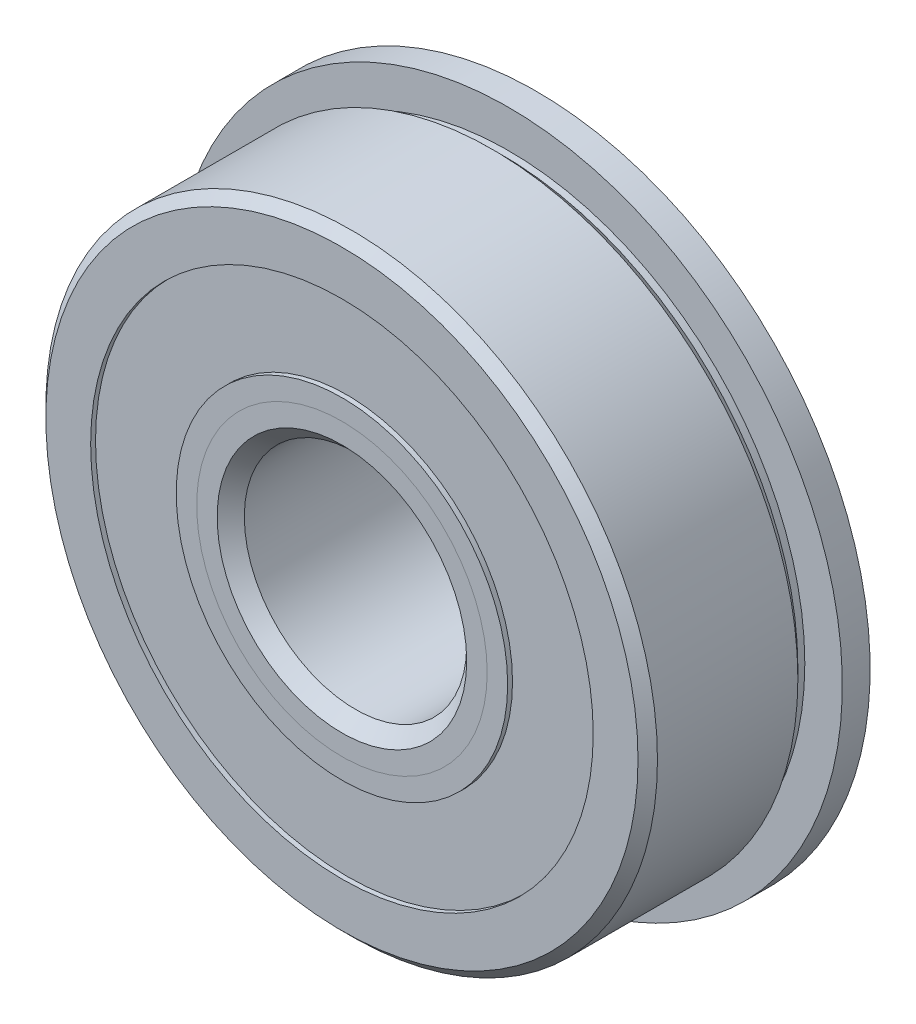
ISO-10303-21;
HEADER;
FILE_DESCRIPTION(('STEP AP214'),'2;1');
FILE_NAME('part.step','',(''),(''),'','','');
FILE_SCHEMA(('AUTOMOTIVE_DESIGN { 1 0 10303 214 1 1 1 1 }'));
ENDSEC;
DATA;
#1=APPLICATION_CONTEXT('core data for automotive mechanical design processes');
#2=APPLICATION_PROTOCOL_DEFINITION('international standard','automotive_design',2000,#1);
#3=PRODUCT_CONTEXT('',#1,'mechanical');
#4=PRODUCT('Part','Part','',(#3));
#5=PRODUCT_RELATED_PRODUCT_CATEGORY('part','',(#4));
#6=PRODUCT_DEFINITION_FORMATION('','',#4);
#7=PRODUCT_DEFINITION_CONTEXT('part definition',#1,'design');
#8=PRODUCT_DEFINITION('design','',#6,#7);
#9=PRODUCT_DEFINITION_SHAPE('','',#8);
#10=(LENGTH_UNIT() NAMED_UNIT(*) SI_UNIT(.MILLI.,.METRE.));
#11=(NAMED_UNIT(*) PLANE_ANGLE_UNIT() SI_UNIT($,.RADIAN.));
#12=(NAMED_UNIT(*) SI_UNIT($,.STERADIAN.) SOLID_ANGLE_UNIT());
#13=UNCERTAINTY_MEASURE_WITH_UNIT(LENGTH_MEASURE(1.E-05),#10,'distance_accuracy_value','');
#14=(GEOMETRIC_REPRESENTATION_CONTEXT(3) GLOBAL_UNCERTAINTY_ASSIGNED_CONTEXT((#13)) GLOBAL_UNIT_ASSIGNED_CONTEXT((#10,
#11,#12)) REPRESENTATION_CONTEXT('',''));
#15=CARTESIAN_POINT('',(0.,0.,0.));
#16=DIRECTION('',(0.,0.,1.));
#17=DIRECTION('',(1.,0.,0.));
#18=AXIS2_PLACEMENT_3D('',#15,#16,#17);
#19=CARTESIAN_POINT('',(0.,0.,5.55625));
#20=DIRECTION('',(0.,0.,1.));
#21=DIRECTION('',(1.,0.,0.));
#22=AXIS2_PLACEMENT_3D('',#19,#20,#21);
#23=CYLINDRICAL_SURFACE('',#22,11.5062);
#24=CARTESIAN_POINT('',(0.,0.,-4.00568244671309));
#25=DIRECTION('',(0.,0.,1.));
#26=DIRECTION('',(1.,0.,0.));
#27=AXIS2_PLACEMENT_3D('',#24,#25,#26);
#28=CIRCLE('',#27,11.5062);
#29=CARTESIAN_POINT('',(11.5062,0.,-4.00568244671309));
#30=VERTEX_POINT('',#29);
#31=EDGE_CURVE('E11',#30,#30,#28,.T.);
#32=ORIENTED_EDGE('',*,*,#31,.T.);
#33=EDGE_LOOP('',(#32));
#34=FACE_BOUND('',#33,.T.);
#35=CARTESIAN_POINT('',(0.,0.,-5.0244375));
#36=DIRECTION('',(0.,0.,-1.));
#37=DIRECTION('',(-1.,0.,0.));
#38=AXIS2_PLACEMENT_3D('',#35,#36,#37);
#39=CIRCLE('',#38,11.5062);
#40=CARTESIAN_POINT('',(-11.5062,0.,-5.0244375));
#41=VERTEX_POINT('',#40);
#42=EDGE_CURVE('E66',#41,#41,#39,.T.);
#43=ORIENTED_EDGE('',*,*,#42,.T.);
#44=EDGE_LOOP('',(#43));
#45=FACE_BOUND('',#44,.T.);
#46=ADVANCED_FACE('F45',(#34,#45),#23,.F.);
#47=CARTESIAN_POINT('',(0.,14.3485576923077,-5.2784375));
#48=DIRECTION('',(0.,0.,1.));
#49=DIRECTION('',(1.,0.,0.));
#50=AXIS2_PLACEMENT_3D('',#47,#48,#49);
#51=PLANE('',#50);
#52=CARTESIAN_POINT('',(0.,0.,-5.2784375));
#53=DIRECTION('',(0.,0.,-1.));
#54=DIRECTION('',(-1.,0.,0.));
#55=AXIS2_PLACEMENT_3D('',#52,#53,#54);
#56=CIRCLE('',#55,12.426696);
#57=CARTESIAN_POINT('',(-12.426696,0.,-5.2784375));
#58=VERTEX_POINT('',#57);
#59=EDGE_CURVE('E63',#58,#58,#56,.T.);
#60=ORIENTED_EDGE('',*,*,#59,.F.);
#61=EDGE_LOOP('',(#60));
#62=FACE_BOUND('',#61,.T.);
#63=CARTESIAN_POINT('',(0.,0.,-5.2784375));
#64=DIRECTION('',(0.,0.,1.));
#65=DIRECTION('',(1.,0.,0.));
#66=AXIS2_PLACEMENT_3D('',#63,#64,#65);
#67=CIRCLE('',#66,14.3485576923077);
#68=CARTESIAN_POINT('',(14.3485576923077,0.,-5.2784375));
#69=VERTEX_POINT('',#68);
#70=EDGE_CURVE('E56',#69,#69,#67,.T.);
#71=ORIENTED_EDGE('',*,*,#70,.F.);
#72=EDGE_LOOP('',(#71));
#73=FACE_BOUND('',#72,.T.);
#74=ADVANCED_FACE('F47',(#62,#73),#51,.F.);
#75=CARTESIAN_POINT('',(0.,14.3485576923077,-4.00568244671308));
#76=DIRECTION('',(0.,0.,-1.));
#77=DIRECTION('',(-1.,0.,0.));
#78=AXIS2_PLACEMENT_3D('',#75,#76,#77);
#79=PLANE('',#78);
#80=ORIENTED_EDGE('',*,*,#31,.F.);
#81=EDGE_LOOP('',(#80));
#82=FACE_BOUND('',#81,.T.);
#83=CARTESIAN_POINT('',(0.,0.,-4.00568244671309));
#84=DIRECTION('',(0.,0.,1.));
#85=DIRECTION('',(1.,0.,0.));
#86=AXIS2_PLACEMENT_3D('',#83,#84,#85);
#87=CIRCLE('',#86,14.3485576923077);
#88=CARTESIAN_POINT('',(14.3485576923077,0.,-4.00568244671309));
#89=VERTEX_POINT('',#88);
#90=EDGE_CURVE('E52',#89,#89,#87,.T.);
#91=ORIENTED_EDGE('',*,*,#90,.T.);
#92=EDGE_LOOP('',(#91));
#93=FACE_BOUND('',#92,.T.);
#94=ADVANCED_FACE('F88',(#82,#93),#79,.F.);
#95=CARTESIAN_POINT('',(0.,0.,5.55625));
#96=DIRECTION('',(0.,0.,1.));
#97=DIRECTION('',(1.,0.,0.));
#98=AXIS2_PLACEMENT_3D('',#95,#96,#97);
#99=CYLINDRICAL_SURFACE('',#98,14.3485576923077);
#100=ORIENTED_EDGE('',*,*,#90,.F.);
#101=EDGE_LOOP('',(#100));
#102=FACE_BOUND('',#101,.T.);
#103=ORIENTED_EDGE('',*,*,#70,.T.);
#104=EDGE_LOOP('',(#103));
#105=FACE_BOUND('',#104,.T.);
#106=ADVANCED_FACE('F82',(#102,#105),#99,.T.);
#107=CARTESIAN_POINT('',(0.,0.,-5.0244375));
#108=DIRECTION('',(0.,0.,-1.));
#109=DIRECTION('',(-1.,0.,0.));
#110=AXIS2_PLACEMENT_3D('',#107,#108,#109);
#111=CYLINDRICAL_SURFACE('',#110,12.426696);
#112=CARTESIAN_POINT('',(0.,0.,-5.0244375));
#113=DIRECTION('',(0.,0.,-1.));
#114=DIRECTION('',(-1.,0.,0.));
#115=AXIS2_PLACEMENT_3D('',#112,#113,#114);
#116=CIRCLE('',#115,12.426696);
#117=CARTESIAN_POINT('',(-12.426696,0.,-5.0244375));
#118=VERTEX_POINT('',#117);
#119=EDGE_CURVE('E60',#118,#118,#116,.T.);
#120=ORIENTED_EDGE('',*,*,#119,.F.);
#121=EDGE_LOOP('',(#120));
#122=FACE_BOUND('',#121,.T.);
#123=ORIENTED_EDGE('',*,*,#59,.T.);
#124=EDGE_LOOP('',(#123));
#125=FACE_BOUND('',#124,.T.);
#126=ADVANCED_FACE('F76',(#122,#125),#111,.F.);
#127=CARTESIAN_POINT('',(0.,0.,-5.0244375));
#128=DIRECTION('',(0.,0.,-1.));
#129=DIRECTION('',(-1.,0.,0.));
#130=AXIS2_PLACEMENT_3D('',#127,#128,#129);
#131=PLANE('',#130);
#132=ORIENTED_EDGE('',*,*,#42,.F.);
#133=EDGE_LOOP('',(#132));
#134=FACE_BOUND('',#133,.T.);
#135=ORIENTED_EDGE('',*,*,#119,.T.);
#136=EDGE_LOOP('',(#135));
#137=FACE_BOUND('',#136,.T.);
#138=ADVANCED_FACE('F73',(#134,#137),#131,.T.);
#139=CLOSED_SHELL('',(#46,#74,#94,#106,#126,#138));
#140=MANIFOLD_SOLID_BREP('B2',#139);
#141=CARTESIAN_POINT('',(0.,14.3485576923077,5.2784375));
#142=DIRECTION('',(0.,0.,-1.));
#143=DIRECTION('',(-1.,0.,0.));
#144=AXIS2_PLACEMENT_3D('',#141,#142,#143);
#145=PLANE('',#144);
#146=CARTESIAN_POINT('',(0.,0.,5.2784375));
#147=DIRECTION('',(0.,0.,1.));
#148=DIRECTION('',(1.,0.,0.));
#149=AXIS2_PLACEMENT_3D('',#146,#147,#148);
#150=CIRCLE('',#149,9.46394230769231);
#151=CARTESIAN_POINT('',(9.46394230769231,0.,5.2784375));
#152=VERTEX_POINT('',#151);
#153=EDGE_CURVE('E44',#152,#152,#150,.T.);
#154=ORIENTED_EDGE('',*,*,#153,.F.);
#155=EDGE_LOOP('',(#154));
#156=FACE_BOUND('',#155,.T.);
#157=CARTESIAN_POINT('',(0.,0.,5.2784375));
#158=DIRECTION('',(0.,0.,1.));
#159=DIRECTION('',(1.,0.,0.));
#160=AXIS2_PLACEMENT_3D('',#157,#158,#159);
#161=CIRCLE('',#160,14.3485576923077);
#162=CARTESIAN_POINT('',(14.3485576923077,0.,5.2784375));
#163=VERTEX_POINT('',#162);
#164=EDGE_CURVE('E171',#163,#163,#161,.T.);
#165=ORIENTED_EDGE('',*,*,#164,.T.);
#166=EDGE_LOOP('',(#165));
#167=FACE_BOUND('',#166,.T.);
#168=ADVANCED_FACE('F157',(#156,#167),#145,.F.);
#169=CARTESIAN_POINT('',(0.,0.,5.55625));
#170=DIRECTION('',(0.,0.,1.));
#171=DIRECTION('',(1.,0.,0.));
#172=AXIS2_PLACEMENT_3D('',#169,#170,#171);
#173=CYLINDRICAL_SURFACE('',#172,9.46394230769231);
#174=CARTESIAN_POINT('',(0.,0.,4.00568244671308));
#175=DIRECTION('',(0.,0.,1.));
#176=DIRECTION('',(1.,0.,0.));
#177=AXIS2_PLACEMENT_3D('',#174,#175,#176);
#178=CIRCLE('',#177,9.46394230769231);
#179=CARTESIAN_POINT('',(9.46394230769231,0.,4.00568244671308));
#180=VERTEX_POINT('',#179);
#181=EDGE_CURVE('E163',#180,#180,#178,.T.);
#182=ORIENTED_EDGE('',*,*,#181,.F.);
#183=EDGE_LOOP('',(#182));
#184=FACE_BOUND('',#183,.T.);
#185=ORIENTED_EDGE('',*,*,#153,.T.);
#186=EDGE_LOOP('',(#185));
#187=FACE_BOUND('',#186,.T.);
#188=ADVANCED_FACE('F186',(#184,#187),#173,.F.);
#189=CARTESIAN_POINT('',(0.,14.3485576923077,4.00568244671308));
#190=DIRECTION('',(0.,0.,1.));
#191=DIRECTION('',(1.,0.,0.));
#192=AXIS2_PLACEMENT_3D('',#189,#190,#191);
#193=PLANE('',#192);
#194=CARTESIAN_POINT('',(0.,0.,4.00568244671308));
#195=DIRECTION('',(0.,0.,1.));
#196=DIRECTION('',(1.,0.,0.));
#197=AXIS2_PLACEMENT_3D('',#194,#195,#196);
#198=CIRCLE('',#197,14.3485576923077);
#199=CARTESIAN_POINT('',(14.3485576923077,0.,4.00568244671308));
#200=VERTEX_POINT('',#199);
#201=EDGE_CURVE('E167',#200,#200,#198,.T.);
#202=ORIENTED_EDGE('',*,*,#201,.F.);
#203=EDGE_LOOP('',(#202));
#204=FACE_BOUND('',#203,.T.);
#205=ORIENTED_EDGE('',*,*,#181,.T.);
#206=EDGE_LOOP('',(#205));
#207=FACE_BOUND('',#206,.T.);
#208=ADVANCED_FACE('F181',(#204,#207),#193,.F.);
#209=CARTESIAN_POINT('',(0.,0.,5.55625));
#210=DIRECTION('',(0.,0.,1.));
#211=DIRECTION('',(1.,0.,0.));
#212=AXIS2_PLACEMENT_3D('',#209,#210,#211);
#213=CYLINDRICAL_SURFACE('',#212,14.3485576923077);
#214=ORIENTED_EDGE('',*,*,#164,.F.);
#215=EDGE_LOOP('',(#214));
#216=FACE_BOUND('',#215,.T.);
#217=ORIENTED_EDGE('',*,*,#201,.T.);
#218=EDGE_LOOP('',(#217));
#219=FACE_BOUND('',#218,.T.);
#220=ADVANCED_FACE('F178',(#216,#219),#213,.T.);
#221=CLOSED_SHELL('',(#168,#188,#208,#220));
#222=MANIFOLD_SOLID_BREP('B6',#221);
#223=CARTESIAN_POINT('',(-5.95312499999987,10.3111149638085,0.));
#224=DIRECTION('',(0.,0.,1.));
#225=DIRECTION('',(-0.499999999999989,0.866025403784445,0.));
#226=AXIS2_PLACEMENT_3D('',#223,#224,#225);
#227=SPHERICAL_SURFACE('',#226,4.00568244671308);
#228=CARTESIAN_POINT('',(-5.95312499999987,10.3111149638085,4.00568244671308));
#229=VERTEX_POINT('',#228);
#230=VERTEX_LOOP('',#229);
#231=FACE_BOUND('',#230,.T.);
#232=ADVANCED_FACE('F224',(#231),#227,.T.);
#233=CLOSED_SHELL('',(#232));
#234=MANIFOLD_SOLID_BREP('B39',#233);
#235=CARTESIAN_POINT('',(-10.3111149638084,5.95312500000012,0.));
#236=DIRECTION('',(0.,0.,1.));
#237=DIRECTION('',(-0.866025403784433,0.50000000000001,0.));
#238=AXIS2_PLACEMENT_3D('',#235,#236,#237);
#239=SPHERICAL_SURFACE('',#238,4.00568244671308);
#240=CARTESIAN_POINT('',(-10.3111149638084,5.95312500000012,4.00568244671308));
#241=VERTEX_POINT('',#240);
#242=VERTEX_LOOP('',#241);
#243=FACE_BOUND('',#242,.T.);
#244=ADVANCED_FACE('F244',(#243),#239,.T.);
#245=CLOSED_SHELL('',(#244));
#246=MANIFOLD_SOLID_BREP('B153',#245);
#247=CARTESIAN_POINT('',(-11.90625,1.24711349071803E-13,0.));
#248=DIRECTION('',(0.,0.,1.));
#249=DIRECTION('',(-1.,0.,0.));
#250=AXIS2_PLACEMENT_3D('',#247,#248,#249);
#251=SPHERICAL_SURFACE('',#250,4.00568244671308);
#252=CARTESIAN_POINT('',(-11.90625,1.24711349071803E-13,4.00568244671308));
#253=VERTEX_POINT('',#252);
#254=VERTEX_LOOP('',#253);
#255=FACE_BOUND('',#254,.T.);
#256=ADVANCED_FACE('F264',(#255),#251,.T.);
#257=CLOSED_SHELL('',(#256));
#258=MANIFOLD_SOLID_BREP('B220',#257);
#259=CARTESIAN_POINT('',(-10.3111149638085,-5.9531249999999,0.));
#260=DIRECTION('',(0.,0.,1.));
#261=DIRECTION('',(-0.866025403784443,-0.499999999999992,0.));
#262=AXIS2_PLACEMENT_3D('',#259,#260,#261);
#263=SPHERICAL_SURFACE('',#262,4.00568244671308);
#264=CARTESIAN_POINT('',(-10.3111149638085,-5.9531249999999,4.00568244671308));
#265=VERTEX_POINT('',#264);
#266=VERTEX_LOOP('',#265);
#267=FACE_BOUND('',#266,.T.);
#268=ADVANCED_FACE('F284',(#267),#263,.T.);
#269=CLOSED_SHELL('',(#268));
#270=MANIFOLD_SOLID_BREP('B240',#269);
#271=CARTESIAN_POINT('',(-5.95312500000009,-10.3111149638084,0.));
#272=DIRECTION('',(0.,0.,1.));
#273=DIRECTION('',(-0.500000000000007,-0.866025403784435,0.));
#274=AXIS2_PLACEMENT_3D('',#271,#272,#273);
#275=SPHERICAL_SURFACE('',#274,4.00568244671308);
#276=CARTESIAN_POINT('',(-5.95312500000009,-10.3111149638084,4.00568244671308));
#277=VERTEX_POINT('',#276);
#278=VERTEX_LOOP('',#277);
#279=FACE_BOUND('',#278,.T.);
#280=ADVANCED_FACE('F304',(#279),#275,.T.);
#281=CLOSED_SHELL('',(#280));
#282=MANIFOLD_SOLID_BREP('B260',#281);
#283=CARTESIAN_POINT('',(0.,-11.90625,0.));
#284=DIRECTION('',(0.,0.,1.));
#285=DIRECTION('',(0.,-1.,0.));
#286=AXIS2_PLACEMENT_3D('',#283,#284,#285);
#287=SPHERICAL_SURFACE('',#286,4.00568244671308);
#288=CARTESIAN_POINT('',(0.,-11.90625,4.00568244671308));
#289=VERTEX_POINT('',#288);
#290=VERTEX_LOOP('',#289);
#291=FACE_BOUND('',#290,.T.);
#292=ADVANCED_FACE('F324',(#291),#287,.T.);
#293=CLOSED_SHELL('',(#292));
#294=MANIFOLD_SOLID_BREP('B280',#293);
#295=CARTESIAN_POINT('',(5.95312499999994,-10.3111149638085,0.));
#296=DIRECTION('',(0.,0.,1.));
#297=DIRECTION('',(0.499999999999995,-0.866025403784442,0.));
#298=AXIS2_PLACEMENT_3D('',#295,#296,#297);
#299=SPHERICAL_SURFACE('',#298,4.00568244671308);
#300=CARTESIAN_POINT('',(5.95312499999994,-10.3111149638085,4.00568244671308));
#301=VERTEX_POINT('',#300);
#302=VERTEX_LOOP('',#301);
#303=FACE_BOUND('',#302,.T.);
#304=ADVANCED_FACE('F344',(#303),#299,.T.);
#305=CLOSED_SHELL('',(#304));
#306=MANIFOLD_SOLID_BREP('B300',#305);
#307=CARTESIAN_POINT('',(10.3111149638084,-5.95312500000005,0.));
#308=DIRECTION('',(0.,0.,1.));
#309=DIRECTION('',(0.866025403784436,-0.500000000000004,0.));
#310=AXIS2_PLACEMENT_3D('',#307,#308,#309);
#311=SPHERICAL_SURFACE('',#310,4.00568244671308);
#312=CARTESIAN_POINT('',(10.3111149638084,-5.95312500000005,4.00568244671308));
#313=VERTEX_POINT('',#312);
#314=VERTEX_LOOP('',#313);
#315=FACE_BOUND('',#314,.T.);
#316=ADVANCED_FACE('F364',(#315),#311,.T.);
#317=CLOSED_SHELL('',(#316));
#318=MANIFOLD_SOLID_BREP('B320',#317);
#319=CARTESIAN_POINT('',(11.90625,0.,0.));
#320=DIRECTION('',(0.,0.,1.));
#321=DIRECTION('',(1.,0.,0.));
#322=AXIS2_PLACEMENT_3D('',#319,#320,#321);
#323=SPHERICAL_SURFACE('',#322,4.00568244671308);
#324=CARTESIAN_POINT('',(11.90625,0.,4.00568244671308));
#325=VERTEX_POINT('',#324);
#326=VERTEX_LOOP('',#325);
#327=FACE_BOUND('',#326,.T.);
#328=ADVANCED_FACE('F384',(#327),#323,.T.);
#329=CLOSED_SHELL('',(#328));
#330=MANIFOLD_SOLID_BREP('B340',#329);
#331=CARTESIAN_POINT('',(10.3111149638085,5.95312499999998,0.));
#332=DIRECTION('',(0.,0.,1.));
#333=DIRECTION('',(0.86602540378444,0.499999999999998,0.));
#334=AXIS2_PLACEMENT_3D('',#331,#332,#333);
#335=SPHERICAL_SURFACE('',#334,4.00568244671308);
#336=CARTESIAN_POINT('',(10.3111149638085,5.95312499999998,4.00568244671308));
#337=VERTEX_POINT('',#336);
#338=VERTEX_LOOP('',#337);
#339=FACE_BOUND('',#338,.T.);
#340=ADVANCED_FACE('F404',(#339),#335,.T.);
#341=CLOSED_SHELL('',(#340));
#342=MANIFOLD_SOLID_BREP('B360',#341);
#343=CARTESIAN_POINT('',(5.95312500000001,10.3111149638085,0.));
#344=DIRECTION('',(0.,0.,1.));
#345=DIRECTION('',(0.500000000000001,0.866025403784438,0.));
#346=AXIS2_PLACEMENT_3D('',#343,#344,#345);
#347=SPHERICAL_SURFACE('',#346,4.00568244671308);
#348=CARTESIAN_POINT('',(5.95312500000001,10.3111149638085,4.00568244671308));
#349=VERTEX_POINT('',#348);
#350=VERTEX_LOOP('',#349);
#351=FACE_BOUND('',#350,.T.);
#352=ADVANCED_FACE('F424',(#351),#347,.T.);
#353=CLOSED_SHELL('',(#352));
#354=MANIFOLD_SOLID_BREP('B380',#353);
#355=CARTESIAN_POINT('',(0.,11.90625,0.));
#356=DIRECTION('',(0.,0.,1.));
#357=DIRECTION('',(0.,1.,0.));
#358=AXIS2_PLACEMENT_3D('',#355,#356,#357);
#359=SPHERICAL_SURFACE('',#358,4.00568244671308);
#360=CARTESIAN_POINT('',(0.,11.90625,4.00568244671308));
#361=VERTEX_POINT('',#360);
#362=VERTEX_LOOP('',#361);
#363=FACE_BOUND('',#362,.T.);
#364=ADVANCED_FACE('F446',(#363),#359,.T.);
#365=CLOSED_SHELL('',(#364));
#366=MANIFOLD_SOLID_BREP('B400',#365);
#367=CARTESIAN_POINT('',(0.,6.905625,-7.14375));
#368=DIRECTION('',(0.,0.,1.));
#369=DIRECTION('',(1.,0.,0.));
#370=AXIS2_PLACEMENT_3D('',#367,#368,#369);
#371=PLANE('',#370);
#372=CARTESIAN_POINT('',(0.,0.,-7.14375));
#373=DIRECTION('',(0.,0.,1.));
#374=DIRECTION('',(1.,0.,0.));
#375=AXIS2_PLACEMENT_3D('',#372,#373,#374);
#376=CIRCLE('',#375,6.905625);
#377=CARTESIAN_POINT('',(6.905625,0.,-7.14375));
#378=VERTEX_POINT('',#377);
#379=EDGE_CURVE('E492',#378,#378,#376,.T.);
#380=ORIENTED_EDGE('',*,*,#379,.T.);
#381=EDGE_LOOP('',(#380));
#382=FACE_BOUND('',#381,.T.);
#383=CARTESIAN_POINT('',(0.,0.,-7.14375));
#384=DIRECTION('',(0.,0.,-1.));
#385=DIRECTION('',(-1.,0.,0.));
#386=AXIS2_PLACEMENT_3D('',#383,#384,#385);
#387=CIRCLE('',#386,8.9757885);
#388=CARTESIAN_POINT('',(-8.9757885,0.,-7.14375));
#389=VERTEX_POINT('',#388);
#390=EDGE_CURVE('E511',#389,#389,#387,.T.);
#391=ORIENTED_EDGE('',*,*,#390,.T.);
#392=EDGE_LOOP('',(#391));
#393=FACE_BOUND('',#392,.T.);
#394=ADVANCED_FACE('F466',(#382,#393),#371,.F.);
#395=CARTESIAN_POINT('',(0.,8.29461304216788,5.55625));
#396=DIRECTION('',(0.,0.,-1.));
#397=DIRECTION('',(-1.,0.,0.));
#398=AXIS2_PLACEMENT_3D('',#395,#396,#397);
#399=PLANE('',#398);
#400=CARTESIAN_POINT('',(0.,0.,5.55625));
#401=DIRECTION('',(0.,0.,1.));
#402=DIRECTION('',(1.,0.,0.));
#403=AXIS2_PLACEMENT_3D('',#400,#401,#402);
#404=CIRCLE('',#403,7.12528377664346);
#405=CARTESIAN_POINT('',(7.12528377664346,0.,5.55625));
#406=VERTEX_POINT('',#405);
#407=EDGE_CURVE('E501',#406,#406,#404,.T.);
#408=ORIENTED_EDGE('',*,*,#407,.F.);
#409=EDGE_LOOP('',(#408));
#410=FACE_BOUND('',#409,.T.);
#411=CARTESIAN_POINT('',(0.,0.,5.55625));
#412=DIRECTION('',(0.,0.,1.));
#413=DIRECTION('',(1.,0.,0.));
#414=AXIS2_PLACEMENT_3D('',#411,#412,#413);
#415=CIRCLE('',#414,8.29461304216788);
#416=CARTESIAN_POINT('',(8.29461304216788,0.,5.55625));
#417=VERTEX_POINT('',#416);
#418=EDGE_CURVE('E445',#417,#417,#415,.T.);
#419=ORIENTED_EDGE('',*,*,#418,.T.);
#420=EDGE_LOOP('',(#419));
#421=FACE_BOUND('',#420,.T.);
#422=ADVANCED_FACE('F468',(#410,#421),#399,.F.);
#423=CARTESIAN_POINT('',(0.,0.,4.38692073447558));
#424=DIRECTION('',(0.,0.,1.));
#425=DIRECTION('',(1.,0.,0.));
#426=AXIS2_PLACEMENT_3D('',#423,#424,#425);
#427=CONICAL_SURFACE('',#426,7.12528377664346,0.78539816339745);
#428=ORIENTED_EDGE('',*,*,#418,.F.);
#429=EDGE_LOOP('',(#428));
#430=FACE_BOUND('',#429,.T.);
#431=CARTESIAN_POINT('',(0.,0.,4.38692073447558));
#432=DIRECTION('',(0.,0.,1.));
#433=DIRECTION('',(1.,0.,0.));
#434=AXIS2_PLACEMENT_3D('',#431,#432,#433);
#435=CIRCLE('',#434,7.12528377664346);
#436=CARTESIAN_POINT('',(7.12528377664346,0.,4.38692073447558));
#437=VERTEX_POINT('',#436);
#438=EDGE_CURVE('E473',#437,#437,#435,.T.);
#439=ORIENTED_EDGE('',*,*,#438,.T.);
#440=EDGE_LOOP('',(#439));
#441=FACE_BOUND('',#440,.T.);
#442=ADVANCED_FACE('F557',(#430,#441),#427,.T.);
#443=CARTESIAN_POINT('',(0.,0.,5.55625));
#444=DIRECTION('',(0.,0.,1.));
#445=DIRECTION('',(1.,0.,0.));
#446=AXIS2_PLACEMENT_3D('',#443,#444,#445);
#447=CYLINDRICAL_SURFACE('',#446,7.12528377664346);
#448=ORIENTED_EDGE('',*,*,#438,.F.);
#449=EDGE_LOOP('',(#448));
#450=FACE_BOUND('',#449,.T.);
#451=CARTESIAN_POINT('',(0.,0.,0.));
#452=DIRECTION('',(0.,0.,1.));
#453=DIRECTION('',(1.,0.,0.));
#454=AXIS2_PLACEMENT_3D('',#451,#452,#453);
#455=CIRCLE('',#454,7.12528377664346);
#456=CARTESIAN_POINT('',(7.12528377664346,0.,0.));
#457=VERTEX_POINT('',#456);
#458=EDGE_CURVE('E477',#457,#457,#455,.T.);
#459=ORIENTED_EDGE('',*,*,#458,.T.);
#460=EDGE_LOOP('',(#459));
#461=FACE_BOUND('',#460,.T.);
#462=ADVANCED_FACE('F633',(#450,#461),#447,.T.);
#463=CARTESIAN_POINT('',(0.,7.12528377664346,0.));
#464=DIRECTION('',(0.,0.,-1.));
#465=DIRECTION('',(-1.,0.,0.));
#466=AXIS2_PLACEMENT_3D('',#463,#464,#465);
#467=PLANE('',#466);
#468=ORIENTED_EDGE('',*,*,#458,.F.);
#469=EDGE_LOOP('',(#468));
#470=FACE_BOUND('',#469,.T.);
#471=CARTESIAN_POINT('',(0.,0.,0.));
#472=DIRECTION('',(0.,0.,1.));
#473=DIRECTION('',(1.,0.,0.));
#474=AXIS2_PLACEMENT_3D('',#471,#472,#473);
#475=CIRCLE('',#474,7.90056755328692);
#476=CARTESIAN_POINT('',(7.90056755328692,0.,0.));
#477=VERTEX_POINT('',#476);
#478=EDGE_CURVE('E481',#477,#477,#475,.T.);
#479=ORIENTED_EDGE('',*,*,#478,.T.);
#480=EDGE_LOOP('',(#479));
#481=FACE_BOUND('',#480,.T.);
#482=ADVANCED_FACE('F548',(#470,#481),#467,.F.);
#483=CARTESIAN_POINT('',(0.,0.,0.));
#484=DIRECTION('',(0.,0.,1.));
#485=DIRECTION('',(1.,0.,0.));
#486=AXIS2_PLACEMENT_3D('',#483,#484,#485);
#487=TOROIDAL_SURFACE('',#486,11.90625,4.00568244671308);
#488=ORIENTED_EDGE('',*,*,#478,.F.);
#489=EDGE_LOOP('',(#488));
#490=FACE_BOUND('',#489,.T.);
#491=CARTESIAN_POINT('',(0.,0.,-3.9856557630339));
#492=DIRECTION('',(0.,0.,1.));
#493=DIRECTION('',(1.,0.,0.));
#494=AXIS2_PLACEMENT_3D('',#491,#492,#493);
#495=CIRCLE('',#494,11.5062);
#496=CARTESIAN_POINT('',(11.5062,0.,-3.9856557630339));
#497=VERTEX_POINT('',#496);
#498=EDGE_CURVE('E486',#497,#497,#495,.T.);
#499=ORIENTED_EDGE('',*,*,#498,.T.);
#500=EDGE_LOOP('',(#499));
#501=FACE_BOUND('',#500,.T.);
#502=ADVANCED_FACE('F542',(#490,#501),#487,.F.);
#503=CARTESIAN_POINT('',(0.,0.,5.55625));
#504=DIRECTION('',(0.,0.,1.));
#505=DIRECTION('',(1.,0.,0.));
#506=AXIS2_PLACEMENT_3D('',#503,#504,#505);
#507=CYLINDRICAL_SURFACE('',#506,11.5062);
#508=ORIENTED_EDGE('',*,*,#498,.F.);
#509=EDGE_LOOP('',(#508));
#510=FACE_BOUND('',#509,.T.);
#511=CARTESIAN_POINT('',(0.,0.,-7.14375));
#512=DIRECTION('',(0.,0.,1.));
#513=DIRECTION('',(1.,0.,0.));
#514=AXIS2_PLACEMENT_3D('',#511,#512,#513);
#515=CIRCLE('',#514,11.5062);
#516=CARTESIAN_POINT('',(11.5062,0.,-7.14375));
#517=VERTEX_POINT('',#516);
#518=EDGE_CURVE('E489',#517,#517,#515,.T.);
#519=ORIENTED_EDGE('',*,*,#518,.T.);
#520=EDGE_LOOP('',(#519));
#521=FACE_BOUND('',#520,.T.);
#522=ADVANCED_FACE('F537',(#510,#521),#507,.T.);
#523=CARTESIAN_POINT('',(0.,0.,-7.14375));
#524=DIRECTION('',(0.,0.,-1.));
#525=DIRECTION('',(-1.,0.,0.));
#526=AXIS2_PLACEMENT_3D('',#523,#524,#525);
#527=CIRCLE('',#526,9.4360365);
#528=CARTESIAN_POINT('',(-9.4360365,0.,-7.14375));
#529=VERTEX_POINT('',#528);
#530=EDGE_CURVE('E505',#529,#529,#527,.T.);
#531=ORIENTED_EDGE('',*,*,#530,.F.);
#532=EDGE_LOOP('',(#531));
#533=FACE_BOUND('',#532,.T.);
#534=ORIENTED_EDGE('',*,*,#518,.F.);
#535=EDGE_LOOP('',(#534));
#536=FACE_BOUND('',#535,.T.);
#537=ADVANCED_FACE('F533',(#533,#536),#371,.F.);
#538=CARTESIAN_POINT('',(0.,0.,-6.588125));
#539=DIRECTION('',(0.,0.,-1.));
#540=DIRECTION('',(-1.,0.,0.));
#541=AXIS2_PLACEMENT_3D('',#538,#539,#540);
#542=CONICAL_SURFACE('',#541,6.35,0.785398163397447);
#543=ORIENTED_EDGE('',*,*,#379,.F.);
#544=EDGE_LOOP('',(#543));
#545=FACE_BOUND('',#544,.T.);
#546=CARTESIAN_POINT('',(0.,0.,-6.588125));
#547=DIRECTION('',(0.,0.,1.));
#548=DIRECTION('',(1.,0.,0.));
#549=AXIS2_PLACEMENT_3D('',#546,#547,#548);
#550=CIRCLE('',#549,6.35);
#551=CARTESIAN_POINT('',(6.35,0.,-6.588125));
#552=VERTEX_POINT('',#551);
#553=EDGE_CURVE('E495',#552,#552,#550,.T.);
#554=ORIENTED_EDGE('',*,*,#553,.T.);
#555=EDGE_LOOP('',(#554));
#556=FACE_BOUND('',#555,.T.);
#557=ADVANCED_FACE('F536',(#545,#556),#542,.F.);
#558=CARTESIAN_POINT('',(0.,0.,5.55625));
#559=DIRECTION('',(0.,0.,1.));
#560=DIRECTION('',(1.,0.,0.));
#561=AXIS2_PLACEMENT_3D('',#558,#559,#560);
#562=CYLINDRICAL_SURFACE('',#561,6.35);
#563=ORIENTED_EDGE('',*,*,#553,.F.);
#564=EDGE_LOOP('',(#563));
#565=FACE_BOUND('',#564,.T.);
#566=CARTESIAN_POINT('',(0.,0.,4.78096622335655));
#567=DIRECTION('',(0.,0.,1.));
#568=DIRECTION('',(1.,0.,0.));
#569=AXIS2_PLACEMENT_3D('',#566,#567,#568);
#570=CIRCLE('',#569,6.35);
#571=CARTESIAN_POINT('',(6.35,0.,4.78096622335655));
#572=VERTEX_POINT('',#571);
#573=EDGE_CURVE('E498',#572,#572,#570,.T.);
#574=ORIENTED_EDGE('',*,*,#573,.T.);
#575=EDGE_LOOP('',(#574));
#576=FACE_BOUND('',#575,.T.);
#577=ADVANCED_FACE('F563',(#565,#576),#562,.F.);
#578=CARTESIAN_POINT('',(0.,0.,5.55625));
#579=DIRECTION('',(0.,0.,1.));
#580=DIRECTION('',(1.,0.,0.));
#581=AXIS2_PLACEMENT_3D('',#578,#579,#580);
#582=CONICAL_SURFACE('',#581,7.12528377664346,0.78539816339745);
#583=ORIENTED_EDGE('',*,*,#573,.F.);
#584=EDGE_LOOP('',(#583));
#585=FACE_BOUND('',#584,.T.);
#586=ORIENTED_EDGE('',*,*,#407,.T.);
#587=EDGE_LOOP('',(#586));
#588=FACE_BOUND('',#587,.T.);
#589=ADVANCED_FACE('F529',(#585,#588),#582,.F.);
#590=CARTESIAN_POINT('',(0.,0.,-7.01675));
#591=DIRECTION('',(0.,0.,-1.));
#592=DIRECTION('',(-1.,0.,0.));
#593=AXIS2_PLACEMENT_3D('',#590,#591,#592);
#594=CYLINDRICAL_SURFACE('',#593,9.4360365);
#595=CARTESIAN_POINT('',(0.,0.,-7.01675));
#596=DIRECTION('',(0.,0.,-1.));
#597=DIRECTION('',(-1.,0.,0.));
#598=AXIS2_PLACEMENT_3D('',#595,#596,#597);
#599=CIRCLE('',#598,9.4360365);
#600=CARTESIAN_POINT('',(-9.4360365,0.,-7.01675));
#601=VERTEX_POINT('',#600);
#602=EDGE_CURVE('E504',#601,#601,#599,.T.);
#603=ORIENTED_EDGE('',*,*,#602,.F.);
#604=EDGE_LOOP('',(#603));
#605=FACE_BOUND('',#604,.T.);
#606=ORIENTED_EDGE('',*,*,#530,.T.);
#607=EDGE_LOOP('',(#606));
#608=FACE_BOUND('',#607,.T.);
#609=ADVANCED_FACE('F523',(#605,#608),#594,.F.);
#610=CARTESIAN_POINT('',(0.,0.,-7.01675));
#611=DIRECTION('',(0.,0.,-1.));
#612=DIRECTION('',(-1.,0.,0.));
#613=AXIS2_PLACEMENT_3D('',#610,#611,#612);
#614=PLANE('',#613);
#615=CARTESIAN_POINT('',(0.,0.,-7.01675));
#616=DIRECTION('',(0.,0.,-1.));
#617=DIRECTION('',(-1.,0.,0.));
#618=AXIS2_PLACEMENT_3D('',#615,#616,#617);
#619=CIRCLE('',#618,8.9757885);
#620=CARTESIAN_POINT('',(-8.9757885,0.,-7.01675));
#621=VERTEX_POINT('',#620);
#622=EDGE_CURVE('E508',#621,#621,#619,.T.);
#623=ORIENTED_EDGE('',*,*,#622,.F.);
#624=EDGE_LOOP('',(#623));
#625=FACE_BOUND('',#624,.T.);
#626=ORIENTED_EDGE('',*,*,#602,.T.);
#627=EDGE_LOOP('',(#626));
#628=FACE_BOUND('',#627,.T.);
#629=ADVANCED_FACE('F520',(#625,#628),#614,.T.);
#630=CARTESIAN_POINT('',(0.,0.,-7.01675));
#631=DIRECTION('',(0.,0.,-1.));
#632=DIRECTION('',(-1.,0.,0.));
#633=AXIS2_PLACEMENT_3D('',#630,#631,#632);
#634=CYLINDRICAL_SURFACE('',#633,8.9757885);
#635=ORIENTED_EDGE('',*,*,#622,.T.);
#636=EDGE_LOOP('',(#635));
#637=FACE_BOUND('',#636,.T.);
#638=ORIENTED_EDGE('',*,*,#390,.F.);
#639=EDGE_LOOP('',(#638));
#640=FACE_BOUND('',#639,.T.);
#641=ADVANCED_FACE('F517',(#637,#640),#634,.T.);
#642=CLOSED_SHELL('',(#394,#422,#442,#462,#482,#502,#522,#537,#557,#577,#589,#609,#629,#641));
#643=MANIFOLD_SOLID_BREP('B420',#642);
#644=CARTESIAN_POINT('',(0.,9.46394230769231,5.55625));
#645=DIRECTION('',(0.,0.,-1.));
#646=DIRECTION('',(-1.,0.,0.));
#647=AXIS2_PLACEMENT_3D('',#644,#645,#646);
#648=PLANE('',#647);
#649=CARTESIAN_POINT('',(0.,0.,5.55625));
#650=DIRECTION('',(0.,0.,1.));
#651=DIRECTION('',(1.,0.,0.));
#652=AXIS2_PLACEMENT_3D('',#649,#650,#651);
#653=CIRCLE('',#652,8.29461304216788);
#654=CARTESIAN_POINT('',(8.29461304216788,0.,5.55625));
#655=VERTEX_POINT('',#654);
#656=EDGE_CURVE('E465',#655,#655,#653,.T.);
#657=ORIENTED_EDGE('',*,*,#656,.F.);
#658=EDGE_LOOP('',(#657));
#659=FACE_BOUND('',#658,.T.);
#660=CARTESIAN_POINT('',(0.,0.,5.55625));
#661=DIRECTION('',(0.,0.,1.));
#662=DIRECTION('',(1.,0.,0.));
#663=AXIS2_PLACEMENT_3D('',#660,#661,#662);
#664=CIRCLE('',#663,9.46394230769231);
#665=CARTESIAN_POINT('',(9.46394230769231,0.,5.55625));
#666=VERTEX_POINT('',#665);
#667=EDGE_CURVE('E705',#666,#666,#664,.T.);
#668=ORIENTED_EDGE('',*,*,#667,.T.);
#669=EDGE_LOOP('',(#668));
#670=FACE_BOUND('',#669,.T.);
#671=ADVANCED_FACE('F683',(#659,#670),#648,.F.);
#672=CARTESIAN_POINT('',(0.,0.,5.55625));
#673=DIRECTION('',(0.,0.,1.));
#674=DIRECTION('',(1.,0.,0.));
#675=AXIS2_PLACEMENT_3D('',#672,#673,#674);
#676=CONICAL_SURFACE('',#675,8.29461304216788,0.78539816339745);
#677=CARTESIAN_POINT('',(0.,0.,4.38692073447558));
#678=DIRECTION('',(0.,0.,1.));
#679=DIRECTION('',(1.,0.,0.));
#680=AXIS2_PLACEMENT_3D('',#677,#678,#679);
#681=CIRCLE('',#680,7.12528377664346);
#682=CARTESIAN_POINT('',(7.12528377664346,0.,4.38692073447558));
#683=VERTEX_POINT('',#682);
#684=EDGE_CURVE('E689',#683,#683,#681,.T.);
#685=ORIENTED_EDGE('',*,*,#684,.F.);
#686=EDGE_LOOP('',(#685));
#687=FACE_BOUND('',#686,.T.);
#688=ORIENTED_EDGE('',*,*,#656,.T.);
#689=EDGE_LOOP('',(#688));
#690=FACE_BOUND('',#689,.T.);
#691=ADVANCED_FACE('F730',(#687,#690),#676,.F.);
#692=CARTESIAN_POINT('',(0.,0.,5.55625));
#693=DIRECTION('',(0.,0.,1.));
#694=DIRECTION('',(1.,0.,0.));
#695=AXIS2_PLACEMENT_3D('',#692,#693,#694);
#696=CYLINDRICAL_SURFACE('',#695,7.12528377664346);
#697=CARTESIAN_POINT('',(0.,0.,0.));
#698=DIRECTION('',(0.,0.,1.));
#699=DIRECTION('',(1.,0.,0.));
#700=AXIS2_PLACEMENT_3D('',#697,#698,#699);
#701=CIRCLE('',#700,7.12528377664346);
#702=CARTESIAN_POINT('',(7.12528377664346,0.,0.));
#703=VERTEX_POINT('',#702);
#704=EDGE_CURVE('E693',#703,#703,#701,.T.);
#705=ORIENTED_EDGE('',*,*,#704,.F.);
#706=EDGE_LOOP('',(#705));
#707=FACE_BOUND('',#706,.T.);
#708=ORIENTED_EDGE('',*,*,#684,.T.);
#709=EDGE_LOOP('',(#708));
#710=FACE_BOUND('',#709,.T.);
#711=ADVANCED_FACE('F725',(#707,#710),#696,.F.);
#712=CARTESIAN_POINT('',(0.,7.12528377664346,0.));
#713=DIRECTION('',(0.,0.,1.));
#714=DIRECTION('',(1.,0.,0.));
#715=AXIS2_PLACEMENT_3D('',#712,#713,#714);
#716=PLANE('',#715);
#717=CARTESIAN_POINT('',(0.,0.,0.));
#718=DIRECTION('',(0.,0.,1.));
#719=DIRECTION('',(1.,0.,0.));
#720=AXIS2_PLACEMENT_3D('',#717,#718,#719);
#721=CIRCLE('',#720,7.90056755328692);
#722=CARTESIAN_POINT('',(7.90056755328692,0.,0.));
#723=VERTEX_POINT('',#722);
#724=EDGE_CURVE('E697',#723,#723,#721,.T.);
#725=ORIENTED_EDGE('',*,*,#724,.F.);
#726=EDGE_LOOP('',(#725));
#727=FACE_BOUND('',#726,.T.);
#728=ORIENTED_EDGE('',*,*,#704,.T.);
#729=EDGE_LOOP('',(#728));
#730=FACE_BOUND('',#729,.T.);
#731=ADVANCED_FACE('F719',(#727,#730),#716,.F.);
#732=CARTESIAN_POINT('',(0.,0.,0.));
#733=DIRECTION('',(0.,0.,1.));
#734=DIRECTION('',(1.,0.,0.));
#735=AXIS2_PLACEMENT_3D('',#732,#733,#734);
#736=TOROIDAL_SURFACE('',#735,11.90625,4.00568244671308);
#737=CARTESIAN_POINT('',(0.,0.,3.175));
#738=DIRECTION('',(0.,0.,1.));
#739=DIRECTION('',(1.,0.,0.));
#740=AXIS2_PLACEMENT_3D('',#737,#738,#739);
#741=CIRCLE('',#740,9.46394230769231);
#742=CARTESIAN_POINT('',(9.46394230769231,0.,3.175));
#743=VERTEX_POINT('',#742);
#744=EDGE_CURVE('E702',#743,#743,#741,.T.);
#745=ORIENTED_EDGE('',*,*,#744,.F.);
#746=EDGE_LOOP('',(#745));
#747=FACE_BOUND('',#746,.T.);
#748=ORIENTED_EDGE('',*,*,#724,.T.);
#749=EDGE_LOOP('',(#748));
#750=FACE_BOUND('',#749,.T.);
#751=ADVANCED_FACE('F713',(#747,#750),#736,.F.);
#752=CARTESIAN_POINT('',(0.,0.,5.55625));
#753=DIRECTION('',(0.,0.,1.));
#754=DIRECTION('',(1.,0.,0.));
#755=AXIS2_PLACEMENT_3D('',#752,#753,#754);
#756=CYLINDRICAL_SURFACE('',#755,9.46394230769231);
#757=ORIENTED_EDGE('',*,*,#667,.F.);
#758=EDGE_LOOP('',(#757));
#759=FACE_BOUND('',#758,.T.);
#760=ORIENTED_EDGE('',*,*,#744,.T.);
#761=EDGE_LOOP('',(#760));
#762=FACE_BOUND('',#761,.T.);
#763=ADVANCED_FACE('F710',(#759,#762),#756,.T.);
#764=CLOSED_SHELL('',(#671,#691,#711,#731,#751,#763));
#765=MANIFOLD_SOLID_BREP('B440',#764);
#766=CARTESIAN_POINT('',(0.,0.,5.55625));
#767=DIRECTION('',(0.,0.,1.));
#768=DIRECTION('',(1.,0.,0.));
#769=AXIS2_PLACEMENT_3D('',#766,#767,#768);
#770=CYLINDRICAL_SURFACE('',#769,17.4625);
#771=CARTESIAN_POINT('',(0.,0.,5.000625));
#772=DIRECTION('',(0.,0.,1.));
#773=DIRECTION('',(1.,0.,0.));
#774=AXIS2_PLACEMENT_3D('',#771,#772,#773);
#775=CIRCLE('',#774,17.4625);
#776=CARTESIAN_POINT('',(17.4625,0.,5.000625));
#777=VERTEX_POINT('',#776);
#778=EDGE_CURVE('E785',#777,#777,#775,.T.);
#779=ORIENTED_EDGE('',*,*,#778,.F.);
#780=EDGE_LOOP('',(#779));
#781=FACE_BOUND('',#780,.T.);
#782=CARTESIAN_POINT('',(0.,0.,-3.01625));
#783=DIRECTION('',(0.,0.,1.));
#784=DIRECTION('',(1.,0.,0.));
#785=AXIS2_PLACEMENT_3D('',#782,#783,#784);
#786=CIRCLE('',#785,17.4625);
#787=CARTESIAN_POINT('',(17.4625,0.,-3.01625));
#788=VERTEX_POINT('',#787);
#789=EDGE_CURVE('E812',#788,#788,#786,.T.);
#790=ORIENTED_EDGE('',*,*,#789,.T.);
#791=EDGE_LOOP('',(#790));
#792=FACE_BOUND('',#791,.T.);
#793=ADVANCED_FACE('F774',(#781,#792),#770,.T.);
#794=CARTESIAN_POINT('',(0.,0.,0.));
#795=DIRECTION('',(0.,0.,1.));
#796=DIRECTION('',(1.,0.,0.));
#797=AXIS2_PLACEMENT_3D('',#794,#795,#796);
#798=TOROIDAL_SURFACE('',#797,11.90625,4.00568244671308);
#799=CARTESIAN_POINT('',(0.,0.,3.175));
#800=DIRECTION('',(0.,0.,1.));
#801=DIRECTION('',(1.,0.,0.));
#802=AXIS2_PLACEMENT_3D('',#799,#800,#801);
#803=CIRCLE('',#802,14.3485576923077);
#804=CARTESIAN_POINT('',(14.3485576923077,0.,3.175));
#805=VERTEX_POINT('',#804);
#806=EDGE_CURVE('E797',#805,#805,#803,.T.);
#807=ORIENTED_EDGE('',*,*,#806,.T.);
#808=EDGE_LOOP('',(#807));
#809=FACE_BOUND('',#808,.T.);
#810=CARTESIAN_POINT('',(0.,0.,-3.175));
#811=DIRECTION('',(0.,0.,1.));
#812=DIRECTION('',(1.,0.,0.));
#813=AXIS2_PLACEMENT_3D('',#810,#811,#812);
#814=CIRCLE('',#813,14.3485576923077);
#815=CARTESIAN_POINT('',(14.3485576923077,0.,-3.175));
#816=VERTEX_POINT('',#815);
#817=EDGE_CURVE('E682',#816,#816,#814,.T.);
#818=ORIENTED_EDGE('',*,*,#817,.F.);
#819=EDGE_LOOP('',(#818));
#820=FACE_BOUND('',#819,.T.);
#821=ADVANCED_FACE('F776',(#809,#820),#798,.F.);
#822=CARTESIAN_POINT('',(0.,0.,5.55625));
#823=DIRECTION('',(0.,0.,1.));
#824=DIRECTION('',(1.,0.,0.));
#825=AXIS2_PLACEMENT_3D('',#822,#823,#824);
#826=CYLINDRICAL_SURFACE('',#825,14.3485576923077);
#827=ORIENTED_EDGE('',*,*,#817,.T.);
#828=EDGE_LOOP('',(#827));
#829=FACE_BOUND('',#828,.T.);
#830=CARTESIAN_POINT('',(0.,0.,-5.55625));
#831=DIRECTION('',(0.,0.,1.));
#832=DIRECTION('',(1.,0.,0.));
#833=AXIS2_PLACEMENT_3D('',#830,#831,#832);
#834=CIRCLE('',#833,14.3485576923077);
#835=CARTESIAN_POINT('',(14.3485576923077,0.,-5.55625));
#836=VERTEX_POINT('',#835);
#837=EDGE_CURVE('E781',#836,#836,#834,.T.);
#838=ORIENTED_EDGE('',*,*,#837,.F.);
#839=EDGE_LOOP('',(#838));
#840=FACE_BOUND('',#839,.T.);
#841=ADVANCED_FACE('F834',(#829,#840),#826,.F.);
#842=CARTESIAN_POINT('',(0.,0.,-5.55625));
#843=DIRECTION('',(0.,0.,-1.));
#844=DIRECTION('',(-1.,0.,0.));
#845=AXIS2_PLACEMENT_3D('',#842,#843,#844);
#846=PLANE('',#845);
#847=ORIENTED_EDGE('',*,*,#837,.T.);
#848=EDGE_LOOP('',(#847));
#849=FACE_BOUND('',#848,.T.);
#850=CARTESIAN_POINT('',(0.,0.,-5.55625));
#851=DIRECTION('',(0.,0.,-1.));
#852=DIRECTION('',(-1.,0.,0.));
#853=AXIS2_PLACEMENT_3D('',#850,#851,#852);
#854=CIRCLE('',#853,19.05);
#855=CARTESIAN_POINT('',(-19.05,0.,-5.55625));
#856=VERTEX_POINT('',#855);
#857=EDGE_CURVE('E800',#856,#856,#854,.T.);
#858=ORIENTED_EDGE('',*,*,#857,.T.);
#859=EDGE_LOOP('',(#858));
#860=FACE_BOUND('',#859,.T.);
#861=ADVANCED_FACE('F841',(#849,#860),#846,.T.);
#862=CARTESIAN_POINT('',(0.,0.,5.000625));
#863=DIRECTION('',(0.,0.,-1.));
#864=DIRECTION('',(-1.,0.,0.));
#865=AXIS2_PLACEMENT_3D('',#862,#863,#864);
#866=CONICAL_SURFACE('',#865,17.4625,0.785398163397446);
#867=CARTESIAN_POINT('',(0.,0.,5.55625));
#868=DIRECTION('',(0.,0.,1.));
#869=DIRECTION('',(1.,0.,0.));
#870=AXIS2_PLACEMENT_3D('',#867,#868,#869);
#871=CIRCLE('',#870,16.906875);
#872=CARTESIAN_POINT('',(16.906875,0.,5.55625));
#873=VERTEX_POINT('',#872);
#874=EDGE_CURVE('E789',#873,#873,#871,.T.);
#875=ORIENTED_EDGE('',*,*,#874,.F.);
#876=EDGE_LOOP('',(#875));
#877=FACE_BOUND('',#876,.T.);
#878=ORIENTED_EDGE('',*,*,#778,.T.);
#879=EDGE_LOOP('',(#878));
#880=FACE_BOUND('',#879,.T.);
#881=ADVANCED_FACE('F839',(#877,#880),#866,.T.);
#882=CARTESIAN_POINT('',(0.,0.,5.55625));
#883=DIRECTION('',(0.,0.,-1.));
#884=DIRECTION('',(-1.,0.,0.));
#885=AXIS2_PLACEMENT_3D('',#882,#883,#884);
#886=PLANE('',#885);
#887=CARTESIAN_POINT('',(0.,0.,5.55625));
#888=DIRECTION('',(0.,0.,1.));
#889=DIRECTION('',(1.,0.,0.));
#890=AXIS2_PLACEMENT_3D('',#887,#888,#889);
#891=CIRCLE('',#890,14.3485576923077);
#892=CARTESIAN_POINT('',(14.3485576923077,0.,5.55625));
#893=VERTEX_POINT('',#892);
#894=EDGE_CURVE('E794',#893,#893,#891,.T.);
#895=ORIENTED_EDGE('',*,*,#894,.F.);
#896=EDGE_LOOP('',(#895));
#897=FACE_BOUND('',#896,.T.);
#898=ORIENTED_EDGE('',*,*,#874,.T.);
#899=EDGE_LOOP('',(#898));
#900=FACE_BOUND('',#899,.T.);
#901=ADVANCED_FACE('F861',(#897,#900),#886,.F.);
#902=CARTESIAN_POINT('',(0.,0.,5.55625));
#903=DIRECTION('',(0.,0.,1.));
#904=DIRECTION('',(1.,0.,0.));
#905=AXIS2_PLACEMENT_3D('',#902,#903,#904);
#906=CYLINDRICAL_SURFACE('',#905,14.3485576923077);
#907=ORIENTED_EDGE('',*,*,#806,.F.);
#908=EDGE_LOOP('',(#907));
#909=FACE_BOUND('',#908,.T.);
#910=ORIENTED_EDGE('',*,*,#894,.T.);
#911=EDGE_LOOP('',(#910));
#912=FACE_BOUND('',#911,.T.);
#913=ADVANCED_FACE('F868',(#909,#912),#906,.F.);
#914=CARTESIAN_POINT('',(0.,15.6277163461538,-3.96875));
#915=DIRECTION('',(0.,0.,1.));
#916=DIRECTION('',(1.,0.,0.));
#917=AXIS2_PLACEMENT_3D('',#914,#915,#916);
#918=PLANE('',#917);
#919=CARTESIAN_POINT('',(0.,0.,-3.96875));
#920=DIRECTION('',(0.,0.,-1.));
#921=DIRECTION('',(-1.,0.,0.));
#922=AXIS2_PLACEMENT_3D('',#919,#920,#921);
#923=CIRCLE('',#922,19.05);
#924=CARTESIAN_POINT('',(-19.05,0.,-3.96875));
#925=VERTEX_POINT('',#924);
#926=EDGE_CURVE('E803',#925,#925,#923,.T.);
#927=ORIENTED_EDGE('',*,*,#926,.F.);
#928=EDGE_LOOP('',(#927));
#929=FACE_BOUND('',#928,.T.);
#930=CARTESIAN_POINT('',(0.,0.,-3.96875));
#931=DIRECTION('',(0.,0.,1.));
#932=DIRECTION('',(1.,0.,0.));
#933=AXIS2_PLACEMENT_3D('',#930,#931,#932);
#934=CIRCLE('',#933,16.906875);
#935=CARTESIAN_POINT('',(16.906875,0.,-3.96875));
#936=VERTEX_POINT('',#935);
#937=EDGE_CURVE('E806',#936,#936,#934,.T.);
#938=ORIENTED_EDGE('',*,*,#937,.F.);
#939=EDGE_LOOP('',(#938));
#940=FACE_BOUND('',#939,.T.);
#941=ADVANCED_FACE('F874',(#929,#940),#918,.T.);
#942=CARTESIAN_POINT('',(0.,0.,-7.14375));
#943=DIRECTION('',(0.,0.,-1.));
#944=DIRECTION('',(-1.,0.,0.));
#945=AXIS2_PLACEMENT_3D('',#942,#943,#944);
#946=CYLINDRICAL_SURFACE('',#945,19.05);
#947=ORIENTED_EDGE('',*,*,#926,.T.);
#948=EDGE_LOOP('',(#947));
#949=FACE_BOUND('',#948,.T.);
#950=ORIENTED_EDGE('',*,*,#857,.F.);
#951=EDGE_LOOP('',(#950));
#952=FACE_BOUND('',#951,.T.);
#953=ADVANCED_FACE('F825',(#949,#952),#946,.T.);
#954=CARTESIAN_POINT('',(0.,0.,5.55625));
#955=DIRECTION('',(0.,0.,1.));
#956=DIRECTION('',(1.,0.,0.));
#957=AXIS2_PLACEMENT_3D('',#954,#955,#956);
#958=CYLINDRICAL_SURFACE('',#957,16.906875);
#959=ORIENTED_EDGE('',*,*,#937,.T.);
#960=EDGE_LOOP('',(#959));
#961=FACE_BOUND('',#960,.T.);
#962=CARTESIAN_POINT('',(0.,0.,-3.571875));
#963=DIRECTION('',(0.,0.,1.));
#964=DIRECTION('',(1.,0.,0.));
#965=AXIS2_PLACEMENT_3D('',#962,#963,#964);
#966=CIRCLE('',#965,16.906875);
#967=CARTESIAN_POINT('',(16.906875,0.,-3.571875));
#968=VERTEX_POINT('',#967);
#969=EDGE_CURVE('E809',#968,#968,#966,.T.);
#970=ORIENTED_EDGE('',*,*,#969,.F.);
#971=EDGE_LOOP('',(#970));
#972=FACE_BOUND('',#971,.T.);
#973=ADVANCED_FACE('F819',(#961,#972),#958,.T.);
#974=CARTESIAN_POINT('',(0.,0.,-3.01625));
#975=DIRECTION('',(0.,0.,1.));
#976=DIRECTION('',(1.,0.,0.));
#977=AXIS2_PLACEMENT_3D('',#974,#975,#976);
#978=CONICAL_SURFACE('',#977,17.4625,0.785398163397445);
#979=ORIENTED_EDGE('',*,*,#969,.T.);
#980=EDGE_LOOP('',(#979));
#981=FACE_BOUND('',#980,.T.);
#982=ORIENTED_EDGE('',*,*,#789,.F.);
#983=EDGE_LOOP('',(#982));
#984=FACE_BOUND('',#983,.T.);
#985=ADVANCED_FACE('F817',(#981,#984),#978,.T.);
#986=CLOSED_SHELL('',(#793,#821,#841,#861,#881,#901,#913,#941,#953,#973,#985));
#987=MANIFOLD_SOLID_BREP('B460',#986);
#988=ADVANCED_BREP_SHAPE_REPRESENTATION('',(#18,#140,#222,#234,#246,#258,#270,#282,#294,#306,
#318,#330,#342,#354,#366,#643,#765,#987),#14);
#989=SHAPE_DEFINITION_REPRESENTATION(#9,#988);
ENDSEC;
END-ISO-10303-21;
